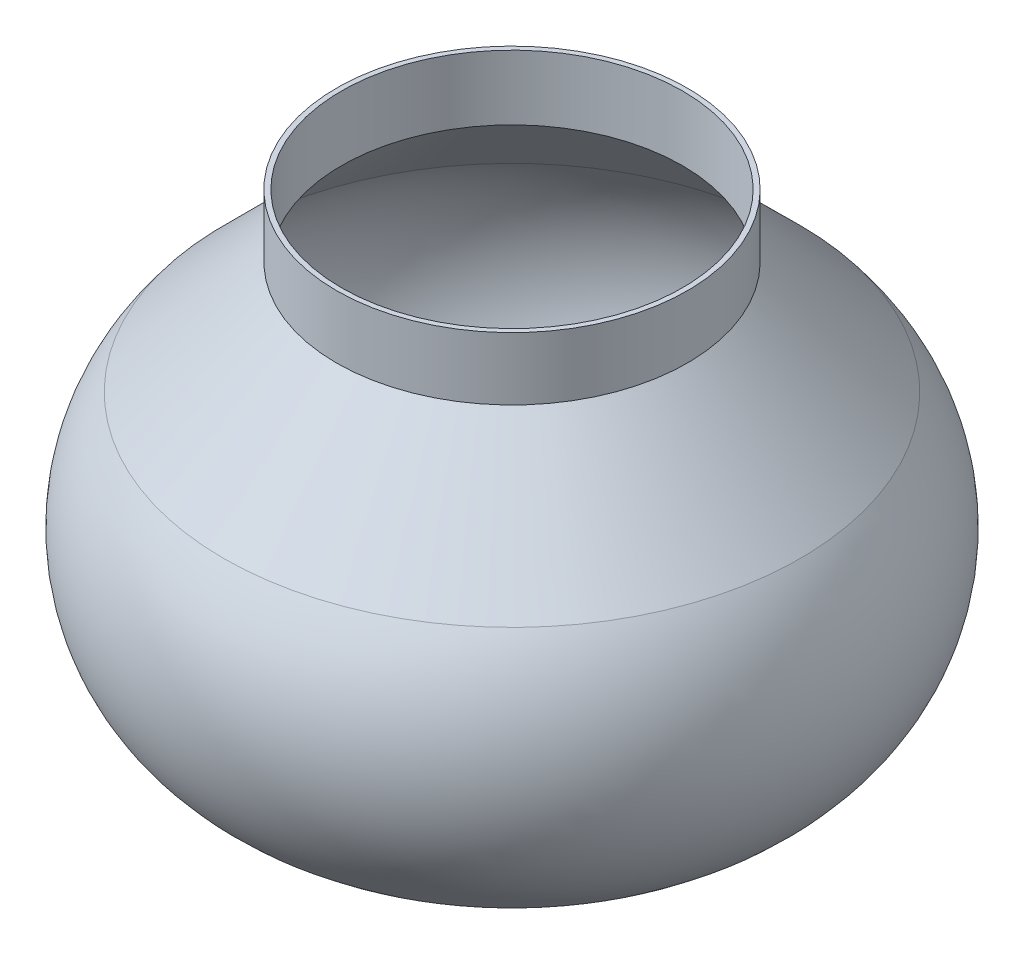
ISO-10303-21;
HEADER;
FILE_DESCRIPTION(('STEP AP214'),'2;1');
FILE_NAME('part.step','',(''),(''),'','','');
FILE_SCHEMA(('AUTOMOTIVE_DESIGN { 1 0 10303 214 1 1 1 1 }'));
ENDSEC;
DATA;
#1=APPLICATION_CONTEXT('core data for automotive mechanical design processes');
#2=APPLICATION_PROTOCOL_DEFINITION('international standard','automotive_design',2000,#1);
#3=PRODUCT_CONTEXT('',#1,'mechanical');
#4=PRODUCT('Part','Part','',(#3));
#5=PRODUCT_RELATED_PRODUCT_CATEGORY('part','',(#4));
#6=PRODUCT_DEFINITION_FORMATION('','',#4);
#7=PRODUCT_DEFINITION_CONTEXT('part definition',#1,'design');
#8=PRODUCT_DEFINITION('design','',#6,#7);
#9=PRODUCT_DEFINITION_SHAPE('','',#8);
#10=(LENGTH_UNIT() NAMED_UNIT(*) SI_UNIT(.MILLI.,.METRE.));
#11=(NAMED_UNIT(*) PLANE_ANGLE_UNIT() SI_UNIT($,.RADIAN.));
#12=(NAMED_UNIT(*) SI_UNIT($,.STERADIAN.) SOLID_ANGLE_UNIT());
#13=UNCERTAINTY_MEASURE_WITH_UNIT(LENGTH_MEASURE(1.E-05),#10,'distance_accuracy_value','');
#14=(GEOMETRIC_REPRESENTATION_CONTEXT(3) GLOBAL_UNCERTAINTY_ASSIGNED_CONTEXT((#13)) GLOBAL_UNIT_ASSIGNED_CONTEXT((#10,
#11,#12)) REPRESENTATION_CONTEXT('',''));
#15=CARTESIAN_POINT('',(0.,0.,0.));
#16=DIRECTION('',(0.,0.,1.));
#17=DIRECTION('',(1.,0.,0.));
#18=AXIS2_PLACEMENT_3D('',#15,#16,#17);
#19=CARTESIAN_POINT('',(0.,0.,0.));
#20=DIRECTION('',(0.,1.,0.));
#21=DIRECTION('',(0.,0.,1.));
#22=AXIS2_PLACEMENT_3D('',#19,#20,#21);
#23=PLANE('',#22);
#24=CARTESIAN_POINT('',(0.,0.,0.));
#25=DIRECTION('',(0.,1.,0.));
#26=DIRECTION('',(0.,0.,1.));
#27=AXIS2_PLACEMENT_3D('',#24,#25,#26);
#28=CIRCLE('',#27,71.12);
#29=CARTESIAN_POINT('',(0.,0.,71.12));
#30=VERTEX_POINT('',#29);
#31=EDGE_CURVE('E10',#30,#30,#28,.T.);
#32=ORIENTED_EDGE('',*,*,#31,.F.);
#33=EDGE_LOOP('',(#32));
#34=FACE_BOUND('',#33,.T.);
#35=ADVANCED_FACE('F37',(#34),#23,.F.);
#36=CARTESIAN_POINT('',(0.,74.4523718621407,0.));
#37=DIRECTION('',(0.,1.,0.));
#38=DIRECTION('',(0.,0.,1.));
#39=AXIS2_PLACEMENT_3D('',#36,#37,#38);
#40=DEGENERATE_TOROIDAL_SURFACE('',#39,58.0136,75.597178498,.T.);
#41=CARTESIAN_POINT('',(0.,121.932768447452,0.));
#42=DIRECTION('',(0.,1.,0.));
#43=DIRECTION('',(0.,0.,1.));
#44=AXIS2_PLACEMENT_3D('',#41,#42,#43);
#45=CIRCLE('',#44,116.84);
#46=CARTESIAN_POINT('',(0.,121.932768447452,116.84));
#47=VERTEX_POINT('',#46);
#48=EDGE_CURVE('E43',#47,#47,#45,.T.);
#49=ORIENTED_EDGE('',*,*,#48,.F.);
#50=EDGE_LOOP('',(#49));
#51=FACE_BOUND('',#50,.T.);
#52=ORIENTED_EDGE('',*,*,#31,.T.);
#53=EDGE_LOOP('',(#52));
#54=FACE_BOUND('',#53,.T.);
#55=ADVANCED_FACE('F103',(#51,#54),#40,.T.);
#56=CARTESIAN_POINT('',(0.,121.932768447452,0.));
#57=DIRECTION('',(0.,-1.,0.));
#58=DIRECTION('',(0.,0.,-1.));
#59=AXIS2_PLACEMENT_3D('',#56,#57,#58);
#60=CONICAL_SURFACE('',#59,116.84,0.785677398401535);
#61=CARTESIAN_POINT('',(0.,167.64,0.));
#62=DIRECTION('',(0.,1.,0.));
#63=DIRECTION('',(0.,0.,1.));
#64=AXIS2_PLACEMENT_3D('',#61,#62,#63);
#65=CIRCLE('',#64,71.1072351990333);
#66=CARTESIAN_POINT('',(0.,167.64,71.1072351990333));
#67=VERTEX_POINT('',#66);
#68=EDGE_CURVE('E47',#67,#67,#65,.T.);
#69=ORIENTED_EDGE('',*,*,#68,.F.);
#70=EDGE_LOOP('',(#69));
#71=FACE_BOUND('',#70,.T.);
#72=ORIENTED_EDGE('',*,*,#48,.T.);
#73=EDGE_LOOP('',(#72));
#74=FACE_BOUND('',#73,.T.);
#75=ADVANCED_FACE('F98',(#71,#74),#60,.T.);
#76=CARTESIAN_POINT('',(0.,167.64,0.));
#77=DIRECTION('',(0.,1.,0.));
#78=DIRECTION('',(0.,0.,1.));
#79=AXIS2_PLACEMENT_3D('',#76,#77,#78);
#80=CYLINDRICAL_SURFACE('',#79,71.1072351990333);
#81=CARTESIAN_POINT('',(0.,193.04,0.));
#82=DIRECTION('',(0.,1.,0.));
#83=DIRECTION('',(0.,0.,1.));
#84=AXIS2_PLACEMENT_3D('',#81,#82,#83);
#85=CIRCLE('',#84,71.1072351990333);
#86=CARTESIAN_POINT('',(0.,193.04,71.1072351990333));
#87=VERTEX_POINT('',#86);
#88=EDGE_CURVE('E51',#87,#87,#85,.T.);
#89=ORIENTED_EDGE('',*,*,#88,.F.);
#90=EDGE_LOOP('',(#89));
#91=FACE_BOUND('',#90,.T.);
#92=ORIENTED_EDGE('',*,*,#68,.T.);
#93=EDGE_LOOP('',(#92));
#94=FACE_BOUND('',#93,.T.);
#95=ADVANCED_FACE('F92',(#91,#94),#80,.T.);
#96=CARTESIAN_POINT('',(69.1072351350332,193.04,0.));
#97=DIRECTION('',(0.,-1.,0.));
#98=DIRECTION('',(0.,0.,-1.));
#99=AXIS2_PLACEMENT_3D('',#96,#97,#98);
#100=PLANE('',#99);
#101=CARTESIAN_POINT('',(0.,193.04,0.));
#102=DIRECTION('',(0.,1.,0.));
#103=DIRECTION('',(0.,0.,1.));
#104=AXIS2_PLACEMENT_3D('',#101,#102,#103);
#105=CIRCLE('',#104,69.1072351350332);
#106=CARTESIAN_POINT('',(0.,193.04,69.1072351350332));
#107=VERTEX_POINT('',#106);
#108=EDGE_CURVE('E56',#107,#107,#105,.T.);
#109=ORIENTED_EDGE('',*,*,#108,.F.);
#110=EDGE_LOOP('',(#109));
#111=FACE_BOUND('',#110,.T.);
#112=ORIENTED_EDGE('',*,*,#88,.T.);
#113=EDGE_LOOP('',(#112));
#114=FACE_BOUND('',#113,.T.);
#115=ADVANCED_FACE('F86',(#111,#114),#100,.F.);
#116=CARTESIAN_POINT('',(0.,167.64,0.));
#117=DIRECTION('',(0.,1.,0.));
#118=DIRECTION('',(0.,0.,1.));
#119=AXIS2_PLACEMENT_3D('',#116,#117,#118);
#120=CYLINDRICAL_SURFACE('',#119,69.1072351350332);
#121=CARTESIAN_POINT('',(0.,166.811245685655,0.));
#122=DIRECTION('',(0.,1.,0.));
#123=DIRECTION('',(0.,0.,1.));
#124=AXIS2_PLACEMENT_3D('',#121,#122,#123);
#125=CIRCLE('',#124,69.1072351350332);
#126=CARTESIAN_POINT('',(0.,166.811245685655,69.1072351350332));
#127=VERTEX_POINT('',#126);
#128=EDGE_CURVE('E59',#127,#127,#125,.T.);
#129=ORIENTED_EDGE('',*,*,#128,.F.);
#130=EDGE_LOOP('',(#129));
#131=FACE_BOUND('',#130,.T.);
#132=ORIENTED_EDGE('',*,*,#108,.T.);
#133=EDGE_LOOP('',(#132));
#134=FACE_BOUND('',#133,.T.);
#135=ADVANCED_FACE('F80',(#131,#134),#120,.F.);
#136=CARTESIAN_POINT('',(0.,166.811245685655,0.));
#137=DIRECTION('',(0.,-1.,0.));
#138=DIRECTION('',(0.,0.,-1.));
#139=AXIS2_PLACEMENT_3D('',#136,#137,#138);
#140=CONICAL_SURFACE('',#139,69.1072351350332,0.785677398401535);
#141=CARTESIAN_POINT('',(0.,120.59409901404,0.));
#142=DIRECTION('',(0.,1.,0.));
#143=DIRECTION('',(0.,0.,1.));
#144=AXIS2_PLACEMENT_3D('',#141,#142,#143);
#145=CIRCLE('',#144,115.350199906915);
#146=CARTESIAN_POINT('',(0.,120.59409901404,115.350199906915));
#147=VERTEX_POINT('',#146);
#148=EDGE_CURVE('E62',#147,#147,#145,.T.);
#149=ORIENTED_EDGE('',*,*,#148,.F.);
#150=EDGE_LOOP('',(#149));
#151=FACE_BOUND('',#150,.T.);
#152=ORIENTED_EDGE('',*,*,#128,.T.);
#153=EDGE_LOOP('',(#152));
#154=FACE_BOUND('',#153,.T.);
#155=ADVANCED_FACE('F74',(#151,#154),#140,.F.);
#156=CARTESIAN_POINT('',(0.,74.4523718621407,0.));
#157=DIRECTION('',(0.,1.,0.));
#158=DIRECTION('',(0.,0.,1.));
#159=AXIS2_PLACEMENT_3D('',#156,#157,#158);
#160=DEGENERATE_TOROIDAL_SURFACE('',#159,58.0136,73.597178434,.T.);
#161=CARTESIAN_POINT('',(0.,2.000000064,0.));
#162=DIRECTION('',(0.,1.,0.));
#163=DIRECTION('',(0.,0.,1.));
#164=AXIS2_PLACEMENT_3D('',#161,#162,#163);
#165=CIRCLE('',#164,70.9441256764769);
#166=CARTESIAN_POINT('',(0.,2.000000064,70.9441256764769));
#167=VERTEX_POINT('',#166);
#168=EDGE_CURVE('E65',#167,#167,#165,.T.);
#169=ORIENTED_EDGE('',*,*,#168,.F.);
#170=EDGE_LOOP('',(#169));
#171=FACE_BOUND('',#170,.T.);
#172=ORIENTED_EDGE('',*,*,#148,.T.);
#173=EDGE_LOOP('',(#172));
#174=FACE_BOUND('',#173,.T.);
#175=ADVANCED_FACE('F71',(#171,#174),#160,.F.);
#176=CARTESIAN_POINT('',(0.,2.00000006400001,0.));
#177=DIRECTION('',(0.,-1.,0.));
#178=DIRECTION('',(0.,0.,-1.));
#179=AXIS2_PLACEMENT_3D('',#176,#177,#178);
#180=PLANE('',#179);
#181=ORIENTED_EDGE('',*,*,#168,.T.);
#182=EDGE_LOOP('',(#181));
#183=FACE_BOUND('',#182,.T.);
#184=ADVANCED_FACE('F69',(#183),#180,.F.);
#185=CLOSED_SHELL('',(#35,#55,#75,#95,#115,#135,#155,#175,#184));
#186=MANIFOLD_SOLID_BREP('B2',#185);
#187=ADVANCED_BREP_SHAPE_REPRESENTATION('',(#18,#186),#14);
#188=SHAPE_DEFINITION_REPRESENTATION(#9,#187);
ENDSEC;
END-ISO-10303-21;
